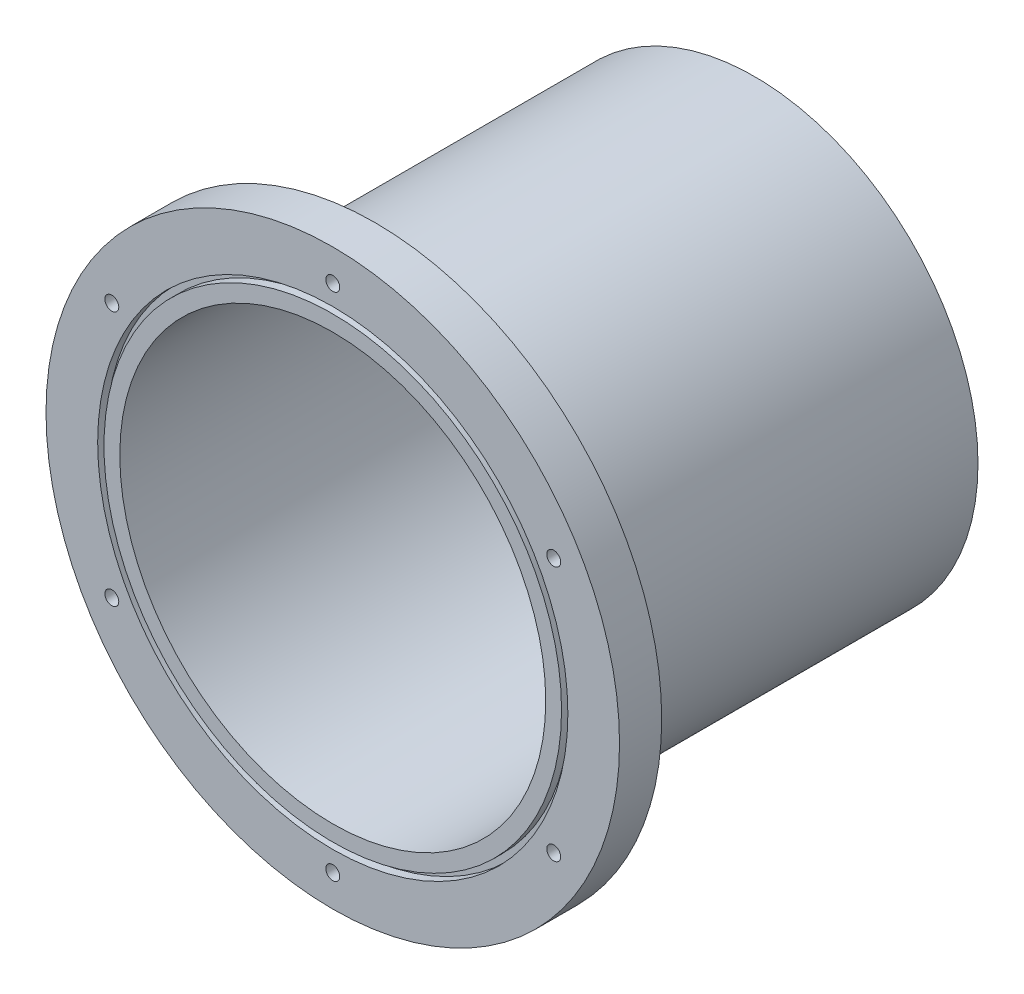
ISO-10303-21;
HEADER;
FILE_DESCRIPTION(('STEP AP214'),'2;1');
FILE_NAME('part.step','',(''),(''),'','','');
FILE_SCHEMA(('AUTOMOTIVE_DESIGN { 1 0 10303 214 1 1 1 1 }'));
ENDSEC;
DATA;
#1=APPLICATION_CONTEXT('core data for automotive mechanical design processes');
#2=APPLICATION_PROTOCOL_DEFINITION('international standard','automotive_design',2000,#1);
#3=PRODUCT_CONTEXT('',#1,'mechanical');
#4=PRODUCT('Part','Part','',(#3));
#5=PRODUCT_RELATED_PRODUCT_CATEGORY('part','',(#4));
#6=PRODUCT_DEFINITION_FORMATION('','',#4);
#7=PRODUCT_DEFINITION_CONTEXT('part definition',#1,'design');
#8=PRODUCT_DEFINITION('design','',#6,#7);
#9=PRODUCT_DEFINITION_SHAPE('','',#8);
#10=(LENGTH_UNIT() NAMED_UNIT(*) SI_UNIT(.MILLI.,.METRE.));
#11=(NAMED_UNIT(*) PLANE_ANGLE_UNIT() SI_UNIT($,.RADIAN.));
#12=(NAMED_UNIT(*) SI_UNIT($,.STERADIAN.) SOLID_ANGLE_UNIT());
#13=UNCERTAINTY_MEASURE_WITH_UNIT(LENGTH_MEASURE(1.E-05),#10,'distance_accuracy_value','');
#14=(GEOMETRIC_REPRESENTATION_CONTEXT(3) GLOBAL_UNCERTAINTY_ASSIGNED_CONTEXT((#13)) GLOBAL_UNIT_ASSIGNED_CONTEXT((#10,
#11,#12)) REPRESENTATION_CONTEXT('',''));
#15=CARTESIAN_POINT('',(0.,0.,0.));
#16=DIRECTION('',(0.,0.,1.));
#17=DIRECTION('',(1.,0.,0.));
#18=AXIS2_PLACEMENT_3D('',#15,#16,#17);
#19=CARTESIAN_POINT('',(0.,0.,200.));
#20=DIRECTION('',(0.,0.,1.));
#21=DIRECTION('',(1.,0.,0.));
#22=AXIS2_PLACEMENT_3D('',#19,#20,#21);
#23=PLANE('',#22);
#24=CARTESIAN_POINT('',(0.,0.,200.));
#25=DIRECTION('',(0.,0.,1.));
#26=DIRECTION('',(1.,0.,0.));
#27=AXIS2_PLACEMENT_3D('',#24,#25,#26);
#28=CIRCLE('',#27,101.);
#29=CARTESIAN_POINT('',(101.,0.,200.));
#30=VERTEX_POINT('',#29);
#31=EDGE_CURVE('E63',#30,#30,#28,.T.);
#32=ORIENTED_EDGE('',*,*,#31,.F.);
#33=EDGE_LOOP('',(#32));
#34=FACE_BOUND('',#33,.T.);
#35=CARTESIAN_POINT('',(0.,0.,200.));
#36=DIRECTION('',(0.,0.,1.));
#37=DIRECTION('',(1.,0.,0.));
#38=AXIS2_PLACEMENT_3D('',#35,#36,#37);
#39=CIRCLE('',#38,108.5);
#40=CARTESIAN_POINT('',(108.5,0.,200.));
#41=VERTEX_POINT('',#40);
#42=EDGE_CURVE('E71',#41,#41,#39,.T.);
#43=ORIENTED_EDGE('',*,*,#42,.T.);
#44=EDGE_LOOP('',(#43));
#45=FACE_BOUND('',#44,.T.);
#46=ADVANCED_FACE('F48',(#34,#45),#23,.T.);
#47=CARTESIAN_POINT('',(0.,0.,200.));
#48=DIRECTION('',(0.,0.,-1.));
#49=DIRECTION('',(-1.,0.,0.));
#50=AXIS2_PLACEMENT_3D('',#47,#48,#49);
#51=CYLINDRICAL_SURFACE('',#50,106.);
#52=CARTESIAN_POINT('',(0.,0.,0.));
#53=DIRECTION('',(0.,0.,1.));
#54=DIRECTION('',(1.,0.,0.));
#55=AXIS2_PLACEMENT_3D('',#52,#53,#54);
#56=CIRCLE('',#55,106.);
#57=CARTESIAN_POINT('',(106.,0.,0.));
#58=VERTEX_POINT('',#57);
#59=EDGE_CURVE('E57',#58,#58,#56,.T.);
#60=ORIENTED_EDGE('',*,*,#59,.T.);
#61=EDGE_LOOP('',(#60));
#62=FACE_BOUND('',#61,.T.);
#63=CARTESIAN_POINT('',(0.,0.,180.));
#64=DIRECTION('',(0.,0.,1.));
#65=DIRECTION('',(1.,0.,0.));
#66=AXIS2_PLACEMENT_3D('',#63,#64,#65);
#67=CIRCLE('',#66,106.);
#68=CARTESIAN_POINT('',(106.,0.,180.));
#69=VERTEX_POINT('',#68);
#70=EDGE_CURVE('E11',#69,#69,#67,.T.);
#71=ORIENTED_EDGE('',*,*,#70,.F.);
#72=EDGE_LOOP('',(#71));
#73=FACE_BOUND('',#72,.T.);
#74=ADVANCED_FACE('F50',(#62,#73),#51,.T.);
#75=CARTESIAN_POINT('',(-104.789073857916,60.5000000000012,200.));
#76=DIRECTION('',(0.,0.,1.));
#77=DIRECTION('',(0.50000000000001,0.866025403784433,0.));
#78=AXIS2_PLACEMENT_3D('',#75,#76,#77);
#79=CIRCLE('',#78,3.29999999999999);
#80=CARTESIAN_POINT('',(-103.139073857916,63.3578838324898,200.));
#81=VERTEX_POINT('',#80);
#82=EDGE_CURVE('E168',#81,#81,#79,.T.);
#83=ORIENTED_EDGE('',*,*,#82,.F.);
#84=EDGE_LOOP('',(#83));
#85=FACE_BOUND('',#84,.T.);
#86=CARTESIAN_POINT('',(-104.789073857918,-60.499999999999,200.));
#87=DIRECTION('',(0.,0.,1.));
#88=DIRECTION('',(-0.499999999999992,0.866025403784443,0.));
#89=AXIS2_PLACEMENT_3D('',#86,#87,#88);
#90=CIRCLE('',#89,3.29999999999999);
#91=CARTESIAN_POINT('',(-106.439073857918,-57.6421161675104,200.));
#92=VERTEX_POINT('',#91);
#93=EDGE_CURVE('E172',#92,#92,#90,.T.);
#94=ORIENTED_EDGE('',*,*,#93,.F.);
#95=EDGE_LOOP('',(#94));
#96=FACE_BOUND('',#95,.T.);
#97=CARTESIAN_POINT('',(0.,-121.,200.));
#98=DIRECTION('',(0.,0.,1.));
#99=DIRECTION('',(-1.,0.,0.));
#100=AXIS2_PLACEMENT_3D('',#97,#98,#99);
#101=CIRCLE('',#100,3.29999999999999);
#102=CARTESIAN_POINT('',(-3.29999999999999,-121.,200.));
#103=VERTEX_POINT('',#102);
#104=EDGE_CURVE('E176',#103,#103,#101,.T.);
#105=ORIENTED_EDGE('',*,*,#104,.F.);
#106=EDGE_LOOP('',(#105));
#107=FACE_BOUND('',#106,.T.);
#108=CARTESIAN_POINT('',(104.789073857917,-60.5000000000005,200.));
#109=DIRECTION('',(0.,0.,1.));
#110=DIRECTION('',(-0.500000000000004,-0.866025403784436,0.));
#111=AXIS2_PLACEMENT_3D('',#108,#109,#110);
#112=CIRCLE('',#111,3.29999999999999);
#113=CARTESIAN_POINT('',(103.139073857917,-63.3578838324891,200.));
#114=VERTEX_POINT('',#113);
#115=EDGE_CURVE('E180',#114,#114,#112,.T.);
#116=ORIENTED_EDGE('',*,*,#115,.F.);
#117=EDGE_LOOP('',(#116));
#118=FACE_BOUND('',#117,.T.);
#119=CARTESIAN_POINT('',(104.789073857917,60.4999999999998,200.));
#120=DIRECTION('',(0.,0.,1.));
#121=DIRECTION('',(0.499999999999998,-0.86602540378444,0.));
#122=AXIS2_PLACEMENT_3D('',#119,#120,#121);
#123=CIRCLE('',#122,3.29999999999999);
#124=CARTESIAN_POINT('',(106.439073857917,57.6421161675111,200.));
#125=VERTEX_POINT('',#124);
#126=EDGE_CURVE('E78',#125,#125,#123,.T.);
#127=ORIENTED_EDGE('',*,*,#126,.F.);
#128=EDGE_LOOP('',(#127));
#129=FACE_BOUND('',#128,.T.);
#130=CARTESIAN_POINT('',(0.,121.,200.));
#131=DIRECTION('',(0.,0.,1.));
#132=DIRECTION('',(1.,0.,0.));
#133=AXIS2_PLACEMENT_3D('',#130,#131,#132);
#134=CIRCLE('',#133,3.29999999999999);
#135=CARTESIAN_POINT('',(3.29999999999999,121.,200.));
#136=VERTEX_POINT('',#135);
#137=EDGE_CURVE('E72',#136,#136,#134,.T.);
#138=ORIENTED_EDGE('',*,*,#137,.F.);
#139=EDGE_LOOP('',(#138));
#140=FACE_BOUND('',#139,.T.);
#141=CARTESIAN_POINT('',(0.,0.,200.));
#142=DIRECTION('',(0.,0.,1.));
#143=DIRECTION('',(1.,0.,0.));
#144=AXIS2_PLACEMENT_3D('',#141,#142,#143);
#145=CIRCLE('',#144,111.5);
#146=CARTESIAN_POINT('',(111.5,0.,200.));
#147=VERTEX_POINT('',#146);
#148=EDGE_CURVE('E106',#147,#147,#145,.T.);
#149=ORIENTED_EDGE('',*,*,#148,.F.);
#150=EDGE_LOOP('',(#149));
#151=FACE_BOUND('',#150,.T.);
#152=CARTESIAN_POINT('',(0.,0.,200.));
#153=DIRECTION('',(0.,0.,1.));
#154=DIRECTION('',(1.,0.,0.));
#155=AXIS2_PLACEMENT_3D('',#152,#153,#154);
#156=CIRCLE('',#155,136.);
#157=CARTESIAN_POINT('',(136.,0.,200.));
#158=VERTEX_POINT('',#157);
#159=EDGE_CURVE('E114',#158,#158,#156,.T.);
#160=ORIENTED_EDGE('',*,*,#159,.T.);
#161=EDGE_LOOP('',(#160));
#162=FACE_BOUND('',#161,.T.);
#163=ADVANCED_FACE('F146',(#85,#96,#107,#118,#129,#140,#151,#162),#23,.T.);
#164=CARTESIAN_POINT('',(0.,0.,0.));
#165=DIRECTION('',(0.,0.,1.));
#166=DIRECTION('',(1.,0.,0.));
#167=AXIS2_PLACEMENT_3D('',#164,#165,#166);
#168=PLANE('',#167);
#169=ORIENTED_EDGE('',*,*,#59,.F.);
#170=EDGE_LOOP('',(#169));
#171=FACE_BOUND('',#170,.T.);
#172=CARTESIAN_POINT('',(0.,0.,0.));
#173=DIRECTION('',(0.,0.,1.));
#174=DIRECTION('',(1.,0.,0.));
#175=AXIS2_PLACEMENT_3D('',#172,#173,#174);
#176=CIRCLE('',#175,101.);
#177=CARTESIAN_POINT('',(101.,0.,0.));
#178=VERTEX_POINT('',#177);
#179=EDGE_CURVE('E122',#178,#178,#176,.T.);
#180=ORIENTED_EDGE('',*,*,#179,.T.);
#181=EDGE_LOOP('',(#180));
#182=FACE_BOUND('',#181,.T.);
#183=ADVANCED_FACE('F132',(#171,#182),#168,.F.);
#184=CARTESIAN_POINT('',(0.,0.,200.));
#185=DIRECTION('',(0.,0.,-1.));
#186=DIRECTION('',(-1.,0.,0.));
#187=AXIS2_PLACEMENT_3D('',#184,#185,#186);
#188=CYLINDRICAL_SURFACE('',#187,101.);
#189=ORIENTED_EDGE('',*,*,#31,.T.);
#190=EDGE_LOOP('',(#189));
#191=FACE_BOUND('',#190,.T.);
#192=ORIENTED_EDGE('',*,*,#179,.F.);
#193=EDGE_LOOP('',(#192));
#194=FACE_BOUND('',#193,.T.);
#195=ADVANCED_FACE('F134',(#191,#194),#188,.F.);
#196=CARTESIAN_POINT('',(0.,0.,180.));
#197=DIRECTION('',(0.,0.,1.));
#198=DIRECTION('',(1.,0.,0.));
#199=AXIS2_PLACEMENT_3D('',#196,#197,#198);
#200=CYLINDRICAL_SURFACE('',#199,136.);
#201=CARTESIAN_POINT('',(0.,0.,180.));
#202=DIRECTION('',(0.,0.,1.));
#203=DIRECTION('',(1.,0.,0.));
#204=AXIS2_PLACEMENT_3D('',#201,#202,#203);
#205=CIRCLE('',#204,136.);
#206=CARTESIAN_POINT('',(136.,0.,180.));
#207=VERTEX_POINT('',#206);
#208=EDGE_CURVE('E118',#207,#207,#205,.T.);
#209=ORIENTED_EDGE('',*,*,#208,.T.);
#210=EDGE_LOOP('',(#209));
#211=FACE_BOUND('',#210,.T.);
#212=ORIENTED_EDGE('',*,*,#159,.F.);
#213=EDGE_LOOP('',(#212));
#214=FACE_BOUND('',#213,.T.);
#215=ADVANCED_FACE('F136',(#211,#214),#200,.T.);
#216=CARTESIAN_POINT('',(0.,0.,180.));
#217=DIRECTION('',(0.,0.,1.));
#218=DIRECTION('',(1.,0.,0.));
#219=AXIS2_PLACEMENT_3D('',#216,#217,#218);
#220=PLANE('',#219);
#221=CARTESIAN_POINT('',(-104.789073857916,60.5000000000012,180.));
#222=DIRECTION('',(0.,0.,1.));
#223=DIRECTION('',(1.,0.,0.));
#224=AXIS2_PLACEMENT_3D('',#221,#222,#223);
#225=CIRCLE('',#224,3.29999999999999);
#226=CARTESIAN_POINT('',(-101.489073857916,60.5000000000012,180.));
#227=VERTEX_POINT('',#226);
#228=EDGE_CURVE('E52',#227,#227,#225,.T.);
#229=ORIENTED_EDGE('',*,*,#228,.T.);
#230=EDGE_LOOP('',(#229));
#231=FACE_BOUND('',#230,.T.);
#232=CARTESIAN_POINT('',(-104.789073857918,-60.499999999999,180.));
#233=DIRECTION('',(0.,0.,1.));
#234=DIRECTION('',(1.,0.,0.));
#235=AXIS2_PLACEMENT_3D('',#232,#233,#234);
#236=CIRCLE('',#235,3.29999999999999);
#237=CARTESIAN_POINT('',(-101.489073857918,-60.499999999999,180.));
#238=VERTEX_POINT('',#237);
#239=EDGE_CURVE('E85',#238,#238,#236,.T.);
#240=ORIENTED_EDGE('',*,*,#239,.T.);
#241=EDGE_LOOP('',(#240));
#242=FACE_BOUND('',#241,.T.);
#243=CARTESIAN_POINT('',(0.,-121.,180.));
#244=DIRECTION('',(0.,0.,1.));
#245=DIRECTION('',(1.,0.,0.));
#246=AXIS2_PLACEMENT_3D('',#243,#244,#245);
#247=CIRCLE('',#246,3.29999999999999);
#248=CARTESIAN_POINT('',(3.29999999999999,-121.,180.));
#249=VERTEX_POINT('',#248);
#250=EDGE_CURVE('E82',#249,#249,#247,.T.);
#251=ORIENTED_EDGE('',*,*,#250,.T.);
#252=EDGE_LOOP('',(#251));
#253=FACE_BOUND('',#252,.T.);
#254=CARTESIAN_POINT('',(104.789073857917,-60.5000000000005,180.));
#255=DIRECTION('',(0.,0.,1.));
#256=DIRECTION('',(1.,0.,0.));
#257=AXIS2_PLACEMENT_3D('',#254,#255,#256);
#258=CIRCLE('',#257,3.29999999999999);
#259=CARTESIAN_POINT('',(108.089073857917,-60.5000000000005,180.));
#260=VERTEX_POINT('',#259);
#261=EDGE_CURVE('E77',#260,#260,#258,.T.);
#262=ORIENTED_EDGE('',*,*,#261,.T.);
#263=EDGE_LOOP('',(#262));
#264=FACE_BOUND('',#263,.T.);
#265=CARTESIAN_POINT('',(104.789073857917,60.4999999999998,180.));
#266=DIRECTION('',(0.,0.,1.));
#267=DIRECTION('',(1.,0.,0.));
#268=AXIS2_PLACEMENT_3D('',#265,#266,#267);
#269=CIRCLE('',#268,3.29999999999999);
#270=CARTESIAN_POINT('',(108.089073857917,60.4999999999998,180.));
#271=VERTEX_POINT('',#270);
#272=EDGE_CURVE('E73',#271,#271,#269,.T.);
#273=ORIENTED_EDGE('',*,*,#272,.T.);
#274=EDGE_LOOP('',(#273));
#275=FACE_BOUND('',#274,.T.);
#276=CARTESIAN_POINT('',(0.,121.,180.));
#277=DIRECTION('',(0.,0.,1.));
#278=DIRECTION('',(1.,0.,0.));
#279=AXIS2_PLACEMENT_3D('',#276,#277,#278);
#280=CIRCLE('',#279,3.29999999999999);
#281=CARTESIAN_POINT('',(3.29999999999999,121.,180.));
#282=VERTEX_POINT('',#281);
#283=EDGE_CURVE('E67',#282,#282,#280,.T.);
#284=ORIENTED_EDGE('',*,*,#283,.T.);
#285=EDGE_LOOP('',(#284));
#286=FACE_BOUND('',#285,.T.);
#287=ORIENTED_EDGE('',*,*,#70,.T.);
#288=EDGE_LOOP('',(#287));
#289=FACE_BOUND('',#288,.T.);
#290=ORIENTED_EDGE('',*,*,#208,.F.);
#291=EDGE_LOOP('',(#290));
#292=FACE_BOUND('',#291,.T.);
#293=ADVANCED_FACE('F143',(#231,#242,#253,#264,#275,#286,#289,#292),#220,.F.);
#294=CARTESIAN_POINT('',(0.,0.,196.));
#295=DIRECTION('',(0.,0.,1.));
#296=DIRECTION('',(1.,0.,0.));
#297=AXIS2_PLACEMENT_3D('',#294,#295,#296);
#298=CYLINDRICAL_SURFACE('',#297,111.5);
#299=CARTESIAN_POINT('',(0.,0.,196.));
#300=DIRECTION('',(0.,0.,1.));
#301=DIRECTION('',(1.,0.,0.));
#302=AXIS2_PLACEMENT_3D('',#299,#300,#301);
#303=CIRCLE('',#302,111.5);
#304=CARTESIAN_POINT('',(111.5,0.,196.));
#305=VERTEX_POINT('',#304);
#306=EDGE_CURVE('E110',#305,#305,#303,.T.);
#307=ORIENTED_EDGE('',*,*,#306,.F.);
#308=EDGE_LOOP('',(#307));
#309=FACE_BOUND('',#308,.T.);
#310=ORIENTED_EDGE('',*,*,#148,.T.);
#311=EDGE_LOOP('',(#310));
#312=FACE_BOUND('',#311,.T.);
#313=ADVANCED_FACE('F190',(#309,#312),#298,.F.);
#314=CARTESIAN_POINT('',(0.,0.,196.));
#315=DIRECTION('',(0.,0.,1.));
#316=DIRECTION('',(1.,0.,0.));
#317=AXIS2_PLACEMENT_3D('',#314,#315,#316);
#318=PLANE('',#317);
#319=CARTESIAN_POINT('',(0.,0.,196.));
#320=DIRECTION('',(0.,0.,1.));
#321=DIRECTION('',(1.,0.,0.));
#322=AXIS2_PLACEMENT_3D('',#319,#320,#321);
#323=CIRCLE('',#322,108.5);
#324=CARTESIAN_POINT('',(108.5,0.,196.));
#325=VERTEX_POINT('',#324);
#326=EDGE_CURVE('E102',#325,#325,#323,.T.);
#327=ORIENTED_EDGE('',*,*,#326,.F.);
#328=EDGE_LOOP('',(#327));
#329=FACE_BOUND('',#328,.T.);
#330=ORIENTED_EDGE('',*,*,#306,.T.);
#331=EDGE_LOOP('',(#330));
#332=FACE_BOUND('',#331,.T.);
#333=ADVANCED_FACE('F192',(#329,#332),#318,.T.);
#334=CARTESIAN_POINT('',(0.,0.,196.));
#335=DIRECTION('',(0.,0.,1.));
#336=DIRECTION('',(1.,0.,0.));
#337=AXIS2_PLACEMENT_3D('',#334,#335,#336);
#338=CYLINDRICAL_SURFACE('',#337,108.5);
#339=ORIENTED_EDGE('',*,*,#326,.T.);
#340=EDGE_LOOP('',(#339));
#341=FACE_BOUND('',#340,.T.);
#342=ORIENTED_EDGE('',*,*,#42,.F.);
#343=EDGE_LOOP('',(#342));
#344=FACE_BOUND('',#343,.T.);
#345=ADVANCED_FACE('F198',(#341,#344),#338,.T.);
#346=CARTESIAN_POINT('',(0.,121.,167.));
#347=DIRECTION('',(0.,0.,1.));
#348=DIRECTION('',(1.,0.,0.));
#349=AXIS2_PLACEMENT_3D('',#346,#347,#348);
#350=CYLINDRICAL_SURFACE('',#349,3.29999999999999);
#351=ORIENTED_EDGE('',*,*,#137,.T.);
#352=EDGE_LOOP('',(#351));
#353=FACE_BOUND('',#352,.T.);
#354=ORIENTED_EDGE('',*,*,#283,.F.);
#355=EDGE_LOOP('',(#354));
#356=FACE_BOUND('',#355,.T.);
#357=ADVANCED_FACE('F206',(#353,#356),#350,.F.);
#358=CARTESIAN_POINT('',(104.789073857917,60.4999999999998,167.));
#359=DIRECTION('',(0.,0.,1.));
#360=DIRECTION('',(1.,0.,0.));
#361=AXIS2_PLACEMENT_3D('',#358,#359,#360);
#362=CYLINDRICAL_SURFACE('',#361,3.29999999999999);
#363=ORIENTED_EDGE('',*,*,#126,.T.);
#364=EDGE_LOOP('',(#363));
#365=FACE_BOUND('',#364,.T.);
#366=ORIENTED_EDGE('',*,*,#272,.F.);
#367=EDGE_LOOP('',(#366));
#368=FACE_BOUND('',#367,.T.);
#369=ADVANCED_FACE('F210',(#365,#368),#362,.F.);
#370=CARTESIAN_POINT('',(104.789073857917,-60.5000000000005,167.));
#371=DIRECTION('',(0.,0.,1.));
#372=DIRECTION('',(1.,0.,0.));
#373=AXIS2_PLACEMENT_3D('',#370,#371,#372);
#374=CYLINDRICAL_SURFACE('',#373,3.29999999999999);
#375=ORIENTED_EDGE('',*,*,#115,.T.);
#376=EDGE_LOOP('',(#375));
#377=FACE_BOUND('',#376,.T.);
#378=ORIENTED_EDGE('',*,*,#261,.F.);
#379=EDGE_LOOP('',(#378));
#380=FACE_BOUND('',#379,.T.);
#381=ADVANCED_FACE('F213',(#377,#380),#374,.F.);
#382=CARTESIAN_POINT('',(0.,-121.,167.));
#383=DIRECTION('',(0.,0.,1.));
#384=DIRECTION('',(1.,0.,0.));
#385=AXIS2_PLACEMENT_3D('',#382,#383,#384);
#386=CYLINDRICAL_SURFACE('',#385,3.29999999999999);
#387=ORIENTED_EDGE('',*,*,#104,.T.);
#388=EDGE_LOOP('',(#387));
#389=FACE_BOUND('',#388,.T.);
#390=ORIENTED_EDGE('',*,*,#250,.F.);
#391=EDGE_LOOP('',(#390));
#392=FACE_BOUND('',#391,.T.);
#393=ADVANCED_FACE('F222',(#389,#392),#386,.F.);
#394=CARTESIAN_POINT('',(-104.789073857918,-60.499999999999,167.));
#395=DIRECTION('',(0.,0.,1.));
#396=DIRECTION('',(1.,0.,0.));
#397=AXIS2_PLACEMENT_3D('',#394,#395,#396);
#398=CYLINDRICAL_SURFACE('',#397,3.29999999999999);
#399=ORIENTED_EDGE('',*,*,#93,.T.);
#400=EDGE_LOOP('',(#399));
#401=FACE_BOUND('',#400,.T.);
#402=ORIENTED_EDGE('',*,*,#239,.F.);
#403=EDGE_LOOP('',(#402));
#404=FACE_BOUND('',#403,.T.);
#405=ADVANCED_FACE('F218',(#401,#404),#398,.F.);
#406=CARTESIAN_POINT('',(-104.789073857916,60.5000000000012,167.));
#407=DIRECTION('',(0.,0.,1.));
#408=DIRECTION('',(1.,0.,0.));
#409=AXIS2_PLACEMENT_3D('',#406,#407,#408);
#410=CYLINDRICAL_SURFACE('',#409,3.29999999999999);
#411=ORIENTED_EDGE('',*,*,#82,.T.);
#412=EDGE_LOOP('',(#411));
#413=FACE_BOUND('',#412,.T.);
#414=ORIENTED_EDGE('',*,*,#228,.F.);
#415=EDGE_LOOP('',(#414));
#416=FACE_BOUND('',#415,.T.);
#417=ADVANCED_FACE('F215',(#413,#416),#410,.F.);
#418=CLOSED_SHELL('',(#46,#74,#163,#183,#195,#215,#293,#313,#333,#345,#357,#369,#381,#393,#405,#417));
#419=MANIFOLD_SOLID_BREP('B2',#418);
#420=ADVANCED_BREP_SHAPE_REPRESENTATION('',(#18,#419),#14);
#421=SHAPE_DEFINITION_REPRESENTATION(#9,#420);
ENDSEC;
END-ISO-10303-21;
